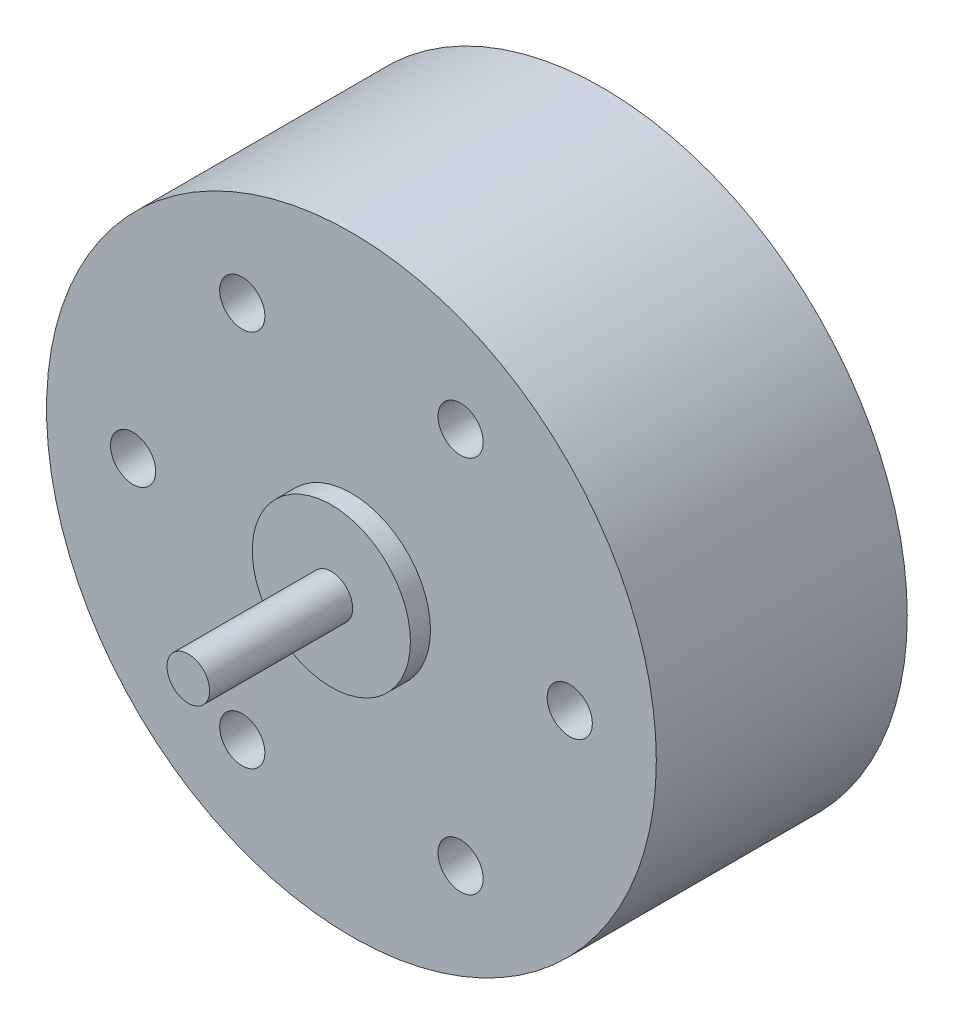
ISO-10303-21;
HEADER;
FILE_DESCRIPTION(('STEP AP214'),'2;1');
FILE_NAME('part.step','',(''),(''),'','','');
FILE_SCHEMA(('AUTOMOTIVE_DESIGN { 1 0 10303 214 1 1 1 1 }'));
ENDSEC;
DATA;
#1=APPLICATION_CONTEXT('core data for automotive mechanical design processes');
#2=APPLICATION_PROTOCOL_DEFINITION('international standard','automotive_design',2000,#1);
#3=PRODUCT_CONTEXT('',#1,'mechanical');
#4=PRODUCT('Part','Part','',(#3));
#5=PRODUCT_RELATED_PRODUCT_CATEGORY('part','',(#4));
#6=PRODUCT_DEFINITION_FORMATION('','',#4);
#7=PRODUCT_DEFINITION_CONTEXT('part definition',#1,'design');
#8=PRODUCT_DEFINITION('design','',#6,#7);
#9=PRODUCT_DEFINITION_SHAPE('','',#8);
#10=(LENGTH_UNIT() NAMED_UNIT(*) SI_UNIT(.MILLI.,.METRE.));
#11=(NAMED_UNIT(*) PLANE_ANGLE_UNIT() SI_UNIT($,.RADIAN.));
#12=(NAMED_UNIT(*) SI_UNIT($,.STERADIAN.) SOLID_ANGLE_UNIT());
#13=UNCERTAINTY_MEASURE_WITH_UNIT(LENGTH_MEASURE(1.E-05),#10,'distance_accuracy_value','');
#14=(GEOMETRIC_REPRESENTATION_CONTEXT(3) GLOBAL_UNCERTAINTY_ASSIGNED_CONTEXT((#13)) GLOBAL_UNIT_ASSIGNED_CONTEXT((#10,
#11,#12)) REPRESENTATION_CONTEXT('',''));
#15=CARTESIAN_POINT('',(0.,0.,0.));
#16=DIRECTION('',(0.,0.,1.));
#17=DIRECTION('',(1.,0.,0.));
#18=AXIS2_PLACEMENT_3D('',#15,#16,#17);
#19=CARTESIAN_POINT('',(0.,0.,10.));
#20=DIRECTION('',(0.,0.,-1.));
#21=DIRECTION('',(-1.,0.,0.));
#22=AXIS2_PLACEMENT_3D('',#19,#20,#21);
#23=CYLINDRICAL_SURFACE('',#22,12.15);
#24=CARTESIAN_POINT('',(0.,0.,10.));
#25=DIRECTION('',(0.,0.,1.));
#26=DIRECTION('',(1.,0.,0.));
#27=AXIS2_PLACEMENT_3D('',#24,#25,#26);
#28=CIRCLE('',#27,12.15);
#29=CARTESIAN_POINT('',(12.15,0.,10.));
#30=VERTEX_POINT('',#29);
#31=EDGE_CURVE('E113',#30,#30,#28,.T.);
#32=ORIENTED_EDGE('',*,*,#31,.F.);
#33=EDGE_LOOP('',(#32));
#34=FACE_BOUND('',#33,.T.);
#35=CARTESIAN_POINT('',(0.,0.,0.));
#36=DIRECTION('',(0.,0.,1.));
#37=DIRECTION('',(1.,0.,0.));
#38=AXIS2_PLACEMENT_3D('',#35,#36,#37);
#39=CIRCLE('',#38,12.15);
#40=CARTESIAN_POINT('',(12.15,0.,0.));
#41=VERTEX_POINT('',#40);
#42=EDGE_CURVE('E36',#41,#41,#39,.T.);
#43=ORIENTED_EDGE('',*,*,#42,.T.);
#44=EDGE_LOOP('',(#43));
#45=FACE_BOUND('',#44,.T.);
#46=ADVANCED_FACE('F33',(#34,#45),#23,.T.);
#47=CARTESIAN_POINT('',(0.,0.,10.));
#48=DIRECTION('',(0.,0.,1.));
#49=DIRECTION('',(1.,0.,0.));
#50=AXIS2_PLACEMENT_3D('',#47,#48,#49);
#51=PLANE('',#50);
#52=CARTESIAN_POINT('',(-4.34999999999999,7.53442101292462,10.));
#53=DIRECTION('',(0.,0.,1.));
#54=DIRECTION('',(1.,0.,0.));
#55=AXIS2_PLACEMENT_3D('',#52,#53,#54);
#56=CIRCLE('',#55,0.9);
#57=CARTESIAN_POINT('',(-3.44999999999999,7.53442101292462,10.));
#58=VERTEX_POINT('',#57);
#59=EDGE_CURVE('E72',#58,#58,#56,.T.);
#60=ORIENTED_EDGE('',*,*,#59,.F.);
#61=EDGE_LOOP('',(#60));
#62=FACE_BOUND('',#61,.T.);
#63=CARTESIAN_POINT('',(4.35000000000001,7.53442101292461,10.));
#64=DIRECTION('',(0.,0.,1.));
#65=DIRECTION('',(1.,0.,0.));
#66=AXIS2_PLACEMENT_3D('',#63,#64,#65);
#67=CIRCLE('',#66,0.9);
#68=CARTESIAN_POINT('',(5.25000000000001,7.53442101292461,10.));
#69=VERTEX_POINT('',#68);
#70=EDGE_CURVE('E71',#69,#69,#67,.T.);
#71=ORIENTED_EDGE('',*,*,#70,.F.);
#72=EDGE_LOOP('',(#71));
#73=FACE_BOUND('',#72,.T.);
#74=CARTESIAN_POINT('',(8.7,0.,10.));
#75=DIRECTION('',(0.,0.,1.));
#76=DIRECTION('',(1.,0.,0.));
#77=AXIS2_PLACEMENT_3D('',#74,#75,#76);
#78=CIRCLE('',#77,0.9);
#79=CARTESIAN_POINT('',(9.6,0.,10.));
#80=VERTEX_POINT('',#79);
#81=EDGE_CURVE('E82',#80,#80,#78,.T.);
#82=ORIENTED_EDGE('',*,*,#81,.F.);
#83=EDGE_LOOP('',(#82));
#84=FACE_BOUND('',#83,.T.);
#85=CARTESIAN_POINT('',(4.35000000000009,-7.53442101292456,10.));
#86=DIRECTION('',(0.,0.,1.));
#87=DIRECTION('',(1.,0.,0.));
#88=AXIS2_PLACEMENT_3D('',#85,#86,#87);
#89=CIRCLE('',#88,0.9);
#90=CARTESIAN_POINT('',(5.25000000000009,-7.53442101292456,10.));
#91=VERTEX_POINT('',#90);
#92=EDGE_CURVE('E88',#91,#91,#89,.T.);
#93=ORIENTED_EDGE('',*,*,#92,.F.);
#94=EDGE_LOOP('',(#93));
#95=FACE_BOUND('',#94,.T.);
#96=CARTESIAN_POINT('',(-4.34999999999995,-7.53442101292464,10.));
#97=DIRECTION('',(0.,0.,1.));
#98=DIRECTION('',(1.,0.,0.));
#99=AXIS2_PLACEMENT_3D('',#96,#97,#98);
#100=CIRCLE('',#99,0.9);
#101=CARTESIAN_POINT('',(-3.44999999999995,-7.53442101292464,10.));
#102=VERTEX_POINT('',#101);
#103=EDGE_CURVE('E94',#102,#102,#100,.T.);
#104=ORIENTED_EDGE('',*,*,#103,.F.);
#105=EDGE_LOOP('',(#104));
#106=FACE_BOUND('',#105,.T.);
#107=CARTESIAN_POINT('',(-8.7,0.,10.));
#108=DIRECTION('',(0.,0.,1.));
#109=DIRECTION('',(1.,0.,0.));
#110=AXIS2_PLACEMENT_3D('',#107,#108,#109);
#111=CIRCLE('',#110,0.9);
#112=CARTESIAN_POINT('',(-7.8,0.,10.));
#113=VERTEX_POINT('',#112);
#114=EDGE_CURVE('E100',#113,#113,#111,.T.);
#115=ORIENTED_EDGE('',*,*,#114,.F.);
#116=EDGE_LOOP('',(#115));
#117=FACE_BOUND('',#116,.T.);
#118=CARTESIAN_POINT('',(0.,0.,10.));
#119=DIRECTION('',(0.,0.,1.));
#120=DIRECTION('',(1.,0.,0.));
#121=AXIS2_PLACEMENT_3D('',#118,#119,#120);
#122=CIRCLE('',#121,3.15);
#123=CARTESIAN_POINT('',(3.15,0.,10.));
#124=VERTEX_POINT('',#123);
#125=EDGE_CURVE('E41',#124,#124,#122,.T.);
#126=ORIENTED_EDGE('',*,*,#125,.F.);
#127=EDGE_LOOP('',(#126));
#128=FACE_BOUND('',#127,.T.);
#129=ORIENTED_EDGE('',*,*,#31,.T.);
#130=EDGE_LOOP('',(#129));
#131=FACE_BOUND('',#130,.T.);
#132=ADVANCED_FACE('F124',(#62,#73,#84,#95,#106,#117,#128,#131),#51,.T.);
#133=CARTESIAN_POINT('',(0.,0.,0.));
#134=DIRECTION('',(0.,0.,1.));
#135=DIRECTION('',(1.,0.,0.));
#136=AXIS2_PLACEMENT_3D('',#133,#134,#135);
#137=PLANE('',#136);
#138=ORIENTED_EDGE('',*,*,#42,.F.);
#139=EDGE_LOOP('',(#138));
#140=FACE_BOUND('',#139,.T.);
#141=ADVANCED_FACE('F121',(#140),#137,.F.);
#142=CARTESIAN_POINT('',(0.,0.,10.8));
#143=DIRECTION('',(0.,0.,-1.));
#144=DIRECTION('',(-1.,0.,0.));
#145=AXIS2_PLACEMENT_3D('',#142,#143,#144);
#146=CYLINDRICAL_SURFACE('',#145,3.15);
#147=CARTESIAN_POINT('',(0.,0.,10.8));
#148=DIRECTION('',(0.,0.,1.));
#149=DIRECTION('',(1.,0.,0.));
#150=AXIS2_PLACEMENT_3D('',#147,#148,#149);
#151=CIRCLE('',#150,3.15);
#152=CARTESIAN_POINT('',(3.15,0.,10.8));
#153=VERTEX_POINT('',#152);
#154=EDGE_CURVE('E108',#153,#153,#151,.T.);
#155=ORIENTED_EDGE('',*,*,#154,.F.);
#156=EDGE_LOOP('',(#155));
#157=FACE_BOUND('',#156,.T.);
#158=ORIENTED_EDGE('',*,*,#125,.T.);
#159=EDGE_LOOP('',(#158));
#160=FACE_BOUND('',#159,.T.);
#161=ADVANCED_FACE('F123',(#157,#160),#146,.T.);
#162=CARTESIAN_POINT('',(0.,0.,10.8));
#163=DIRECTION('',(0.,0.,1.));
#164=DIRECTION('',(1.,0.,0.));
#165=AXIS2_PLACEMENT_3D('',#162,#163,#164);
#166=PLANE('',#165);
#167=CARTESIAN_POINT('',(0.,0.,10.8));
#168=DIRECTION('',(0.,0.,1.));
#169=DIRECTION('',(1.,0.,0.));
#170=AXIS2_PLACEMENT_3D('',#167,#168,#169);
#171=CIRCLE('',#170,0.85);
#172=CARTESIAN_POINT('',(0.85,0.,10.8));
#173=VERTEX_POINT('',#172);
#174=EDGE_CURVE('E11',#173,#173,#171,.T.);
#175=ORIENTED_EDGE('',*,*,#174,.F.);
#176=EDGE_LOOP('',(#175));
#177=FACE_BOUND('',#176,.T.);
#178=ORIENTED_EDGE('',*,*,#154,.T.);
#179=EDGE_LOOP('',(#178));
#180=FACE_BOUND('',#179,.T.);
#181=ADVANCED_FACE('F129',(#177,#180),#166,.T.);
#182=CARTESIAN_POINT('',(0.,0.,16.5));
#183=DIRECTION('',(0.,0.,-1.));
#184=DIRECTION('',(-1.,0.,0.));
#185=AXIS2_PLACEMENT_3D('',#182,#183,#184);
#186=CYLINDRICAL_SURFACE('',#185,0.85);
#187=CARTESIAN_POINT('',(0.,0.,16.5));
#188=DIRECTION('',(0.,0.,1.));
#189=DIRECTION('',(1.,0.,0.));
#190=AXIS2_PLACEMENT_3D('',#187,#188,#189);
#191=CIRCLE('',#190,0.85);
#192=CARTESIAN_POINT('',(0.85,0.,16.5));
#193=VERTEX_POINT('',#192);
#194=EDGE_CURVE('E106',#193,#193,#191,.T.);
#195=ORIENTED_EDGE('',*,*,#194,.F.);
#196=EDGE_LOOP('',(#195));
#197=FACE_BOUND('',#196,.T.);
#198=ORIENTED_EDGE('',*,*,#174,.T.);
#199=EDGE_LOOP('',(#198));
#200=FACE_BOUND('',#199,.T.);
#201=ADVANCED_FACE('F267',(#197,#200),#186,.T.);
#202=CARTESIAN_POINT('',(0.,0.,16.5));
#203=DIRECTION('',(0.,0.,1.));
#204=DIRECTION('',(1.,0.,0.));
#205=AXIS2_PLACEMENT_3D('',#202,#203,#204);
#206=PLANE('',#205);
#207=ORIENTED_EDGE('',*,*,#194,.T.);
#208=EDGE_LOOP('',(#207));
#209=FACE_BOUND('',#208,.T.);
#210=ADVANCED_FACE('F149',(#209),#206,.T.);
#211=CARTESIAN_POINT('',(-8.7,0.,7.));
#212=DIRECTION('',(0.,0.,1.));
#213=DIRECTION('',(1.,0.,0.));
#214=AXIS2_PLACEMENT_3D('',#211,#212,#213);
#215=CONICAL_SURFACE('',#214,0.899999999999999,1.02974425867665);
#216=CARTESIAN_POINT('',(-8.7,0.,6.4592254428752));
#217=VERTEX_POINT('',#216);
#218=VERTEX_LOOP('',#217);
#219=FACE_BOUND('',#218,.T.);
#220=CARTESIAN_POINT('',(-8.7,0.,7.));
#221=DIRECTION('',(0.,0.,1.));
#222=DIRECTION('',(1.,0.,0.));
#223=AXIS2_PLACEMENT_3D('',#220,#221,#222);
#224=CIRCLE('',#223,0.899999999999999);
#225=CARTESIAN_POINT('',(-7.8,0.,7.));
#226=VERTEX_POINT('',#225);
#227=EDGE_CURVE('E103',#226,#226,#224,.T.);
#228=ORIENTED_EDGE('',*,*,#227,.T.);
#229=EDGE_LOOP('',(#228));
#230=FACE_BOUND('',#229,.T.);
#231=ADVANCED_FACE('F154',(#219,#230),#215,.F.);
#232=CARTESIAN_POINT('',(-8.7,0.,10.));
#233=DIRECTION('',(0.,0.,1.));
#234=DIRECTION('',(1.,0.,0.));
#235=AXIS2_PLACEMENT_3D('',#232,#233,#234);
#236=CYLINDRICAL_SURFACE('',#235,0.899999999999999);
#237=ORIENTED_EDGE('',*,*,#227,.F.);
#238=EDGE_LOOP('',(#237));
#239=FACE_BOUND('',#238,.T.);
#240=ORIENTED_EDGE('',*,*,#114,.T.);
#241=EDGE_LOOP('',(#240));
#242=FACE_BOUND('',#241,.T.);
#243=ADVANCED_FACE('F159',(#239,#242),#236,.F.);
#244=CARTESIAN_POINT('',(-4.34999999999995,-7.53442101292464,7.));
#245=DIRECTION('',(0.,0.,1.));
#246=DIRECTION('',(1.,0.,0.));
#247=AXIS2_PLACEMENT_3D('',#244,#245,#246);
#248=CONICAL_SURFACE('',#247,0.899999999999999,1.02974425867665);
#249=CARTESIAN_POINT('',(-4.34999999999995,-7.53442101292464,6.4592254428752));
#250=VERTEX_POINT('',#249);
#251=VERTEX_LOOP('',#250);
#252=FACE_BOUND('',#251,.T.);
#253=CARTESIAN_POINT('',(-4.34999999999995,-7.53442101292464,7.));
#254=DIRECTION('',(0.,0.,1.));
#255=DIRECTION('',(1.,0.,0.));
#256=AXIS2_PLACEMENT_3D('',#253,#254,#255);
#257=CIRCLE('',#256,0.899999999999999);
#258=CARTESIAN_POINT('',(-3.44999999999995,-7.53442101292464,7.));
#259=VERTEX_POINT('',#258);
#260=EDGE_CURVE('E97',#259,#259,#257,.T.);
#261=ORIENTED_EDGE('',*,*,#260,.T.);
#262=EDGE_LOOP('',(#261));
#263=FACE_BOUND('',#262,.T.);
#264=ADVANCED_FACE('F168',(#252,#263),#248,.F.);
#265=CARTESIAN_POINT('',(-4.34999999999995,-7.53442101292464,10.));
#266=DIRECTION('',(0.,0.,1.));
#267=DIRECTION('',(1.,0.,0.));
#268=AXIS2_PLACEMENT_3D('',#265,#266,#267);
#269=CYLINDRICAL_SURFACE('',#268,0.9);
#270=ORIENTED_EDGE('',*,*,#260,.F.);
#271=EDGE_LOOP('',(#270));
#272=FACE_BOUND('',#271,.T.);
#273=ORIENTED_EDGE('',*,*,#103,.T.);
#274=EDGE_LOOP('',(#273));
#275=FACE_BOUND('',#274,.T.);
#276=ADVANCED_FACE('F178',(#272,#275),#269,.F.);
#277=CARTESIAN_POINT('',(4.35000000000009,-7.53442101292456,7.));
#278=DIRECTION('',(0.,0.,1.));
#279=DIRECTION('',(1.,0.,0.));
#280=AXIS2_PLACEMENT_3D('',#277,#278,#279);
#281=CONICAL_SURFACE('',#280,0.899999999999999,1.02974425867665);
#282=CARTESIAN_POINT('',(4.35000000000009,-7.53442101292456,6.4592254428752));
#283=VERTEX_POINT('',#282);
#284=VERTEX_LOOP('',#283);
#285=FACE_BOUND('',#284,.T.);
#286=CARTESIAN_POINT('',(4.35000000000009,-7.53442101292456,7.));
#287=DIRECTION('',(0.,0.,1.));
#288=DIRECTION('',(1.,0.,0.));
#289=AXIS2_PLACEMENT_3D('',#286,#287,#288);
#290=CIRCLE('',#289,0.899999999999999);
#291=CARTESIAN_POINT('',(5.25000000000009,-7.53442101292456,7.));
#292=VERTEX_POINT('',#291);
#293=EDGE_CURVE('E91',#292,#292,#290,.T.);
#294=ORIENTED_EDGE('',*,*,#293,.T.);
#295=EDGE_LOOP('',(#294));
#296=FACE_BOUND('',#295,.T.);
#297=ADVANCED_FACE('F187',(#285,#296),#281,.F.);
#298=CARTESIAN_POINT('',(4.35000000000009,-7.53442101292456,10.));
#299=DIRECTION('',(0.,0.,1.));
#300=DIRECTION('',(1.,0.,0.));
#301=AXIS2_PLACEMENT_3D('',#298,#299,#300);
#302=CYLINDRICAL_SURFACE('',#301,0.899999999999999);
#303=ORIENTED_EDGE('',*,*,#293,.F.);
#304=EDGE_LOOP('',(#303));
#305=FACE_BOUND('',#304,.T.);
#306=ORIENTED_EDGE('',*,*,#92,.T.);
#307=EDGE_LOOP('',(#306));
#308=FACE_BOUND('',#307,.T.);
#309=ADVANCED_FACE('F197',(#305,#308),#302,.F.);
#310=CARTESIAN_POINT('',(8.7,0.,7.));
#311=DIRECTION('',(0.,0.,1.));
#312=DIRECTION('',(1.,0.,0.));
#313=AXIS2_PLACEMENT_3D('',#310,#311,#312);
#314=CONICAL_SURFACE('',#313,0.9,1.02974425867665);
#315=CARTESIAN_POINT('',(8.7,0.,6.4592254428752));
#316=VERTEX_POINT('',#315);
#317=VERTEX_LOOP('',#316);
#318=FACE_BOUND('',#317,.T.);
#319=CARTESIAN_POINT('',(8.7,0.,7.));
#320=DIRECTION('',(0.,0.,1.));
#321=DIRECTION('',(1.,0.,0.));
#322=AXIS2_PLACEMENT_3D('',#319,#320,#321);
#323=CIRCLE('',#322,0.9);
#324=CARTESIAN_POINT('',(9.6,0.,7.));
#325=VERTEX_POINT('',#324);
#326=EDGE_CURVE('E85',#325,#325,#323,.T.);
#327=ORIENTED_EDGE('',*,*,#326,.T.);
#328=EDGE_LOOP('',(#327));
#329=FACE_BOUND('',#328,.T.);
#330=ADVANCED_FACE('F207',(#318,#329),#314,.F.);
#331=CARTESIAN_POINT('',(8.7,0.,10.));
#332=DIRECTION('',(0.,0.,1.));
#333=DIRECTION('',(1.,0.,0.));
#334=AXIS2_PLACEMENT_3D('',#331,#332,#333);
#335=CYLINDRICAL_SURFACE('',#334,0.9);
#336=ORIENTED_EDGE('',*,*,#326,.F.);
#337=EDGE_LOOP('',(#336));
#338=FACE_BOUND('',#337,.T.);
#339=ORIENTED_EDGE('',*,*,#81,.T.);
#340=EDGE_LOOP('',(#339));
#341=FACE_BOUND('',#340,.T.);
#342=ADVANCED_FACE('F217',(#338,#341),#335,.F.);
#343=CARTESIAN_POINT('',(4.35000000000001,7.53442101292461,7.));
#344=DIRECTION('',(0.,0.,1.));
#345=DIRECTION('',(1.,0.,0.));
#346=AXIS2_PLACEMENT_3D('',#343,#344,#345);
#347=CONICAL_SURFACE('',#346,0.899999999999999,1.02974425867665);
#348=CARTESIAN_POINT('',(4.35000000000001,7.53442101292461,6.4592254428752));
#349=VERTEX_POINT('',#348);
#350=VERTEX_LOOP('',#349);
#351=FACE_BOUND('',#350,.T.);
#352=CARTESIAN_POINT('',(4.35000000000001,7.53442101292461,7.));
#353=DIRECTION('',(0.,0.,1.));
#354=DIRECTION('',(1.,0.,0.));
#355=AXIS2_PLACEMENT_3D('',#352,#353,#354);
#356=CIRCLE('',#355,0.899999999999999);
#357=CARTESIAN_POINT('',(5.25000000000001,7.53442101292461,7.));
#358=VERTEX_POINT('',#357);
#359=EDGE_CURVE('E75',#358,#358,#356,.T.);
#360=ORIENTED_EDGE('',*,*,#359,.T.);
#361=EDGE_LOOP('',(#360));
#362=FACE_BOUND('',#361,.T.);
#363=ADVANCED_FACE('F227',(#351,#362),#347,.F.);
#364=CARTESIAN_POINT('',(4.35000000000001,7.53442101292461,10.));
#365=DIRECTION('',(0.,0.,1.));
#366=DIRECTION('',(1.,0.,0.));
#367=AXIS2_PLACEMENT_3D('',#364,#365,#366);
#368=CYLINDRICAL_SURFACE('',#367,0.899999999999999);
#369=ORIENTED_EDGE('',*,*,#359,.F.);
#370=EDGE_LOOP('',(#369));
#371=FACE_BOUND('',#370,.T.);
#372=ORIENTED_EDGE('',*,*,#70,.T.);
#373=EDGE_LOOP('',(#372));
#374=FACE_BOUND('',#373,.T.);
#375=ADVANCED_FACE('F65',(#371,#374),#368,.F.);
#376=CARTESIAN_POINT('',(-4.34999999999999,7.53442101292462,7.));
#377=DIRECTION('',(0.,0.,1.));
#378=DIRECTION('',(1.,0.,0.));
#379=AXIS2_PLACEMENT_3D('',#376,#377,#378);
#380=CONICAL_SURFACE('',#379,0.899999999999999,1.02974425867665);
#381=CARTESIAN_POINT('',(-4.34999999999999,7.53442101292462,6.4592254428752));
#382=VERTEX_POINT('',#381);
#383=VERTEX_LOOP('',#382);
#384=FACE_BOUND('',#383,.T.);
#385=CARTESIAN_POINT('',(-4.34999999999999,7.53442101292462,7.));
#386=DIRECTION('',(0.,0.,1.));
#387=DIRECTION('',(1.,0.,0.));
#388=AXIS2_PLACEMENT_3D('',#385,#386,#387);
#389=CIRCLE('',#388,0.899999999999999);
#390=CARTESIAN_POINT('',(-3.44999999999999,7.53442101292462,7.));
#391=VERTEX_POINT('',#390);
#392=EDGE_CURVE('E69',#391,#391,#389,.T.);
#393=ORIENTED_EDGE('',*,*,#392,.T.);
#394=EDGE_LOOP('',(#393));
#395=FACE_BOUND('',#394,.T.);
#396=ADVANCED_FACE('F61',(#384,#395),#380,.F.);
#397=CARTESIAN_POINT('',(-4.34999999999999,7.53442101292462,10.));
#398=DIRECTION('',(0.,0.,1.));
#399=DIRECTION('',(1.,0.,0.));
#400=AXIS2_PLACEMENT_3D('',#397,#398,#399);
#401=CYLINDRICAL_SURFACE('',#400,0.9);
#402=ORIENTED_EDGE('',*,*,#392,.F.);
#403=EDGE_LOOP('',(#402));
#404=FACE_BOUND('',#403,.T.);
#405=ORIENTED_EDGE('',*,*,#59,.T.);
#406=EDGE_LOOP('',(#405));
#407=FACE_BOUND('',#406,.T.);
#408=ADVANCED_FACE('F64',(#404,#407),#401,.F.);
#409=CLOSED_SHELL('',(#46,#132,#141,#161,#181,#201,#210,#231,#243,#264,#276,#297,#309,#330,#342,
#363,#375,#396,#408));
#410=MANIFOLD_SOLID_BREP('B2',#409);
#411=ADVANCED_BREP_SHAPE_REPRESENTATION('',(#18,#410),#14);
#412=SHAPE_DEFINITION_REPRESENTATION(#9,#411);
ENDSEC;
END-ISO-10303-21;
